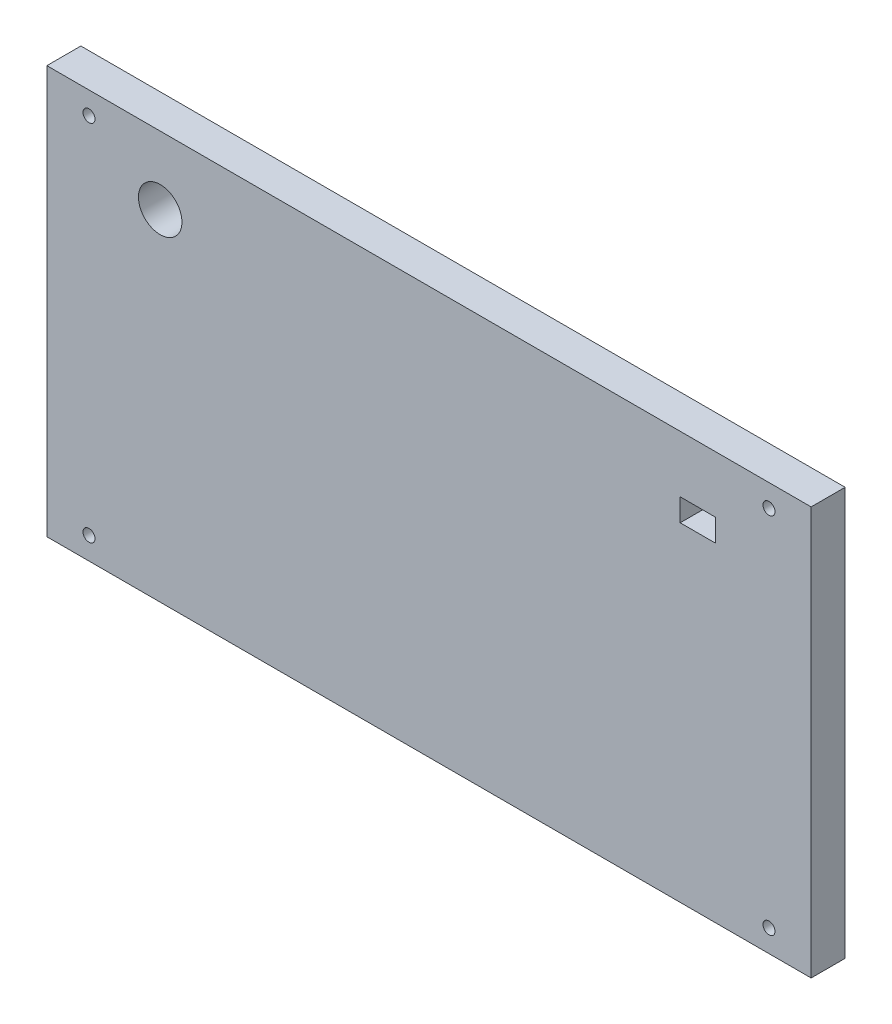
ISO-10303-21;
HEADER;
FILE_DESCRIPTION(('STEP AP214'),'2;1');
FILE_NAME('part.step','',(''),(''),'','','');
FILE_SCHEMA(('AUTOMOTIVE_DESIGN { 1 0 10303 214 1 1 1 1 }'));
ENDSEC;
DATA;
#1=APPLICATION_CONTEXT('core data for automotive mechanical design processes');
#2=APPLICATION_PROTOCOL_DEFINITION('international standard','automotive_design',2000,#1);
#3=PRODUCT_CONTEXT('',#1,'mechanical');
#4=PRODUCT('Part','Part','',(#3));
#5=PRODUCT_RELATED_PRODUCT_CATEGORY('part','',(#4));
#6=PRODUCT_DEFINITION_FORMATION('','',#4);
#7=PRODUCT_DEFINITION_CONTEXT('part definition',#1,'design');
#8=PRODUCT_DEFINITION('design','',#6,#7);
#9=PRODUCT_DEFINITION_SHAPE('','',#8);
#10=(LENGTH_UNIT() NAMED_UNIT(*) SI_UNIT(.MILLI.,.METRE.));
#11=(NAMED_UNIT(*) PLANE_ANGLE_UNIT() SI_UNIT($,.RADIAN.));
#12=(NAMED_UNIT(*) SI_UNIT($,.STERADIAN.) SOLID_ANGLE_UNIT());
#13=UNCERTAINTY_MEASURE_WITH_UNIT(LENGTH_MEASURE(1.E-05),#10,'distance_accuracy_value','');
#14=(GEOMETRIC_REPRESENTATION_CONTEXT(3) GLOBAL_UNCERTAINTY_ASSIGNED_CONTEXT((#13)) GLOBAL_UNIT_ASSIGNED_CONTEXT((#10,
#11,#12)) REPRESENTATION_CONTEXT('',''));
#15=CARTESIAN_POINT('',(0.,0.,0.));
#16=DIRECTION('',(0.,0.,1.));
#17=DIRECTION('',(1.,0.,0.));
#18=AXIS2_PLACEMENT_3D('',#15,#16,#17);
#19=CARTESIAN_POINT('',(0.,0.,19.05));
#20=DIRECTION('',(0.,0.,1.));
#21=DIRECTION('',(1.,0.,0.));
#22=AXIS2_PLACEMENT_3D('',#19,#20,#21);
#23=PLANE('',#22);
#24=DIRECTION('',(0.,1.,0.));
#25=VECTOR('',#24,1.);
#26=CARTESIAN_POINT('',(350.9875,148.0875,19.05));
#27=LINE('',#26,#25);
#28=CARTESIAN_POINT('',(350.9875,148.0875,19.05));
#29=VERTEX_POINT('',#28);
#30=CARTESIAN_POINT('',(350.9875,160.6875,19.05));
#31=VERTEX_POINT('',#30);
#32=EDGE_CURVE('E52',#29,#31,#27,.T.);
#33=ORIENTED_EDGE('',*,*,#32,.F.);
#34=DIRECTION('',(1.,0.,0.));
#35=VECTOR('',#34,1.);
#36=CARTESIAN_POINT('',(331.2375,148.0875,19.05));
#37=LINE('',#36,#35);
#38=CARTESIAN_POINT('',(331.2375,148.0875,19.05));
#39=VERTEX_POINT('',#38);
#40=EDGE_CURVE('E120',#39,#29,#37,.T.);
#41=ORIENTED_EDGE('',*,*,#40,.F.);
#42=DIRECTION('',(0.,-1.,0.));
#43=VECTOR('',#42,1.);
#44=CARTESIAN_POINT('',(331.2375,148.0875,19.05));
#45=LINE('',#44,#43);
#46=CARTESIAN_POINT('',(331.2375,160.6875,19.05));
#47=VERTEX_POINT('',#46);
#48=EDGE_CURVE('E123',#47,#39,#45,.T.);
#49=ORIENTED_EDGE('',*,*,#48,.F.);
#50=DIRECTION('',(-1.,0.,0.));
#51=VECTOR('',#50,1.);
#52=CARTESIAN_POINT('',(331.2375,160.6875,19.05));
#53=LINE('',#52,#51);
#54=EDGE_CURVE('E129',#31,#47,#53,.T.);
#55=ORIENTED_EDGE('',*,*,#54,.F.);
#56=EDGE_LOOP('',(#33,#41,#49,#55));
#57=FACE_BOUND('',#56,.T.);
#58=CARTESIAN_POINT('',(0.,179.9875,19.05));
#59=DIRECTION('',(0.,0.,1.));
#60=DIRECTION('',(-1.,0.,0.));
#61=AXIS2_PLACEMENT_3D('',#58,#59,#60);
#62=CIRCLE('',#61,3.36549999999999);
#63=CARTESIAN_POINT('',(-3.36549999999999,179.9875,19.05));
#64=VERTEX_POINT('',#63);
#65=EDGE_CURVE('E145',#64,#64,#62,.T.);
#66=ORIENTED_EDGE('',*,*,#65,.F.);
#67=EDGE_LOOP('',(#66));
#68=FACE_BOUND('',#67,.T.);
#69=CARTESIAN_POINT('',(381.,-23.6125,19.05));
#70=DIRECTION('',(0.,0.,1.));
#71=DIRECTION('',(-1.,0.,0.));
#72=AXIS2_PLACEMENT_3D('',#69,#70,#71);
#73=CIRCLE('',#72,3.36550000000002);
#74=CARTESIAN_POINT('',(377.6345,-23.6125,19.05));
#75=VERTEX_POINT('',#74);
#76=EDGE_CURVE('E157',#75,#75,#73,.T.);
#77=ORIENTED_EDGE('',*,*,#76,.F.);
#78=EDGE_LOOP('',(#77));
#79=FACE_BOUND('',#78,.T.);
#80=DIRECTION('',(0.,-1.,0.));
#81=VECTOR('',#80,1.);
#82=CARTESIAN_POINT('',(-23.6125000000001,192.4875,19.05));
#83=LINE('',#82,#81);
#84=CARTESIAN_POINT('',(-23.6125000000001,192.4875,19.05));
#85=VERTEX_POINT('',#84);
#86=CARTESIAN_POINT('',(-23.6125000000001,-36.1125,19.05));
#87=VERTEX_POINT('',#86);
#88=EDGE_CURVE('E169',#85,#87,#83,.T.);
#89=ORIENTED_EDGE('',*,*,#88,.T.);
#90=DIRECTION('',(1.,0.,0.));
#91=VECTOR('',#90,1.);
#92=CARTESIAN_POINT('',(-23.6125000000001,-36.1125,19.05));
#93=LINE('',#92,#91);
#94=CARTESIAN_POINT('',(404.6125,-36.1125,19.05));
#95=VERTEX_POINT('',#94);
#96=EDGE_CURVE('E172',#87,#95,#93,.T.);
#97=ORIENTED_EDGE('',*,*,#96,.T.);
#98=DIRECTION('',(0.,1.,0.));
#99=VECTOR('',#98,1.);
#100=CARTESIAN_POINT('',(404.6125,192.4875,19.05));
#101=LINE('',#100,#99);
#102=CARTESIAN_POINT('',(404.6125,192.4875,19.05));
#103=VERTEX_POINT('',#102);
#104=EDGE_CURVE('E175',#95,#103,#101,.T.);
#105=ORIENTED_EDGE('',*,*,#104,.T.);
#106=DIRECTION('',(-1.,0.,0.));
#107=VECTOR('',#106,1.);
#108=CARTESIAN_POINT('',(-23.6125000000001,192.4875,19.05));
#109=LINE('',#108,#107);
#110=EDGE_CURVE('E177',#103,#85,#109,.T.);
#111=ORIENTED_EDGE('',*,*,#110,.T.);
#112=EDGE_LOOP('',(#89,#97,#105,#111));
#113=FACE_BOUND('',#112,.T.);
#114=CARTESIAN_POINT('',(0.,-23.6125,19.05));
#115=DIRECTION('',(0.,0.,1.));
#116=DIRECTION('',(1.,0.,0.));
#117=AXIS2_PLACEMENT_3D('',#114,#115,#116);
#118=CIRCLE('',#117,3.3655);
#119=CARTESIAN_POINT('',(-3.3655,-23.6125,19.05));
#120=VERTEX_POINT('',#119);
#121=EDGE_CURVE('E163',#120,#120,#118,.T.);
#122=ORIENTED_EDGE('',*,*,#121,.F.);
#123=EDGE_LOOP('',(#122));
#124=FACE_BOUND('',#123,.T.);
#125=CARTESIAN_POINT('',(381.,179.9875,19.05));
#126=DIRECTION('',(0.,0.,1.));
#127=DIRECTION('',(1.,0.,0.));
#128=AXIS2_PLACEMENT_3D('',#125,#126,#127);
#129=CIRCLE('',#128,3.36550000000002);
#130=CARTESIAN_POINT('',(377.6345,179.9875,19.05));
#131=VERTEX_POINT('',#130);
#132=EDGE_CURVE('E151',#131,#131,#129,.T.);
#133=ORIENTED_EDGE('',*,*,#132,.F.);
#134=EDGE_LOOP('',(#133));
#135=FACE_BOUND('',#134,.T.);
#136=CARTESIAN_POINT('',(39.8874999999999,154.3875,19.05));
#137=DIRECTION('',(0.,0.,1.));
#138=DIRECTION('',(1.,0.,0.));
#139=AXIS2_PLACEMENT_3D('',#136,#137,#138);
#140=CIRCLE('',#139,12.192);
#141=CARTESIAN_POINT('',(27.6954999999999,154.3875,19.05));
#142=VERTEX_POINT('',#141);
#143=EDGE_CURVE('E139',#142,#142,#140,.T.);
#144=ORIENTED_EDGE('',*,*,#143,.F.);
#145=EDGE_LOOP('',(#144));
#146=FACE_BOUND('',#145,.T.);
#147=ADVANCED_FACE('F37',(#57,#68,#79,#113,#124,#135,#146),#23,.T.);
#148=CARTESIAN_POINT('',(0.,0.,0.));
#149=DIRECTION('',(0.,0.,1.));
#150=DIRECTION('',(1.,0.,0.));
#151=AXIS2_PLACEMENT_3D('',#148,#149,#150);
#152=PLANE('',#151);
#153=DIRECTION('',(1.,0.,0.));
#154=VECTOR('',#153,1.);
#155=CARTESIAN_POINT('',(331.2375,148.0875,0.));
#156=LINE('',#155,#154);
#157=CARTESIAN_POINT('',(331.2375,148.0875,0.));
#158=VERTEX_POINT('',#157);
#159=CARTESIAN_POINT('',(350.9875,148.0875,0.));
#160=VERTEX_POINT('',#159);
#161=EDGE_CURVE('E110',#158,#160,#156,.T.);
#162=ORIENTED_EDGE('',*,*,#161,.T.);
#163=DIRECTION('',(0.,1.,0.));
#164=VECTOR('',#163,1.);
#165=CARTESIAN_POINT('',(350.9875,148.0875,0.));
#166=LINE('',#165,#164);
#167=CARTESIAN_POINT('',(350.9875,160.6875,0.));
#168=VERTEX_POINT('',#167);
#169=EDGE_CURVE('E104',#160,#168,#166,.T.);
#170=ORIENTED_EDGE('',*,*,#169,.T.);
#171=DIRECTION('',(-1.,0.,0.));
#172=VECTOR('',#171,1.);
#173=CARTESIAN_POINT('',(331.2375,160.6875,0.));
#174=LINE('',#173,#172);
#175=CARTESIAN_POINT('',(331.2375,160.6875,0.));
#176=VERTEX_POINT('',#175);
#177=EDGE_CURVE('E113',#168,#176,#174,.T.);
#178=ORIENTED_EDGE('',*,*,#177,.T.);
#179=DIRECTION('',(0.,-1.,0.));
#180=VECTOR('',#179,1.);
#181=CARTESIAN_POINT('',(331.2375,148.0875,0.));
#182=LINE('',#181,#180);
#183=EDGE_CURVE('E60',#176,#158,#182,.T.);
#184=ORIENTED_EDGE('',*,*,#183,.T.);
#185=EDGE_LOOP('',(#162,#170,#178,#184));
#186=FACE_BOUND('',#185,.T.);
#187=DIRECTION('',(0.,-1.,0.));
#188=VECTOR('',#187,1.);
#189=CARTESIAN_POINT('',(-23.6125000000001,192.4875,0.));
#190=LINE('',#189,#188);
#191=CARTESIAN_POINT('',(-23.6125000000001,192.4875,0.));
#192=VERTEX_POINT('',#191);
#193=CARTESIAN_POINT('',(-23.6125000000001,-36.1125,0.));
#194=VERTEX_POINT('',#193);
#195=EDGE_CURVE('E166',#192,#194,#190,.T.);
#196=ORIENTED_EDGE('',*,*,#195,.F.);
#197=DIRECTION('',(-1.,0.,0.));
#198=VECTOR('',#197,1.);
#199=CARTESIAN_POINT('',(-23.6125000000001,192.4875,0.));
#200=LINE('',#199,#198);
#201=CARTESIAN_POINT('',(404.6125,192.4875,0.));
#202=VERTEX_POINT('',#201);
#203=EDGE_CURVE('E173',#202,#192,#200,.T.);
#204=ORIENTED_EDGE('',*,*,#203,.F.);
#205=DIRECTION('',(0.,1.,0.));
#206=VECTOR('',#205,1.);
#207=CARTESIAN_POINT('',(404.6125,192.4875,0.));
#208=LINE('',#207,#206);
#209=CARTESIAN_POINT('',(404.6125,-36.1125,0.));
#210=VERTEX_POINT('',#209);
#211=EDGE_CURVE('E184',#210,#202,#208,.T.);
#212=ORIENTED_EDGE('',*,*,#211,.F.);
#213=DIRECTION('',(1.,0.,0.));
#214=VECTOR('',#213,1.);
#215=CARTESIAN_POINT('',(-23.6125000000001,-36.1125,0.));
#216=LINE('',#215,#214);
#217=EDGE_CURVE('E182',#194,#210,#216,.T.);
#218=ORIENTED_EDGE('',*,*,#217,.F.);
#219=EDGE_LOOP('',(#196,#204,#212,#218));
#220=FACE_BOUND('',#219,.T.);
#221=CARTESIAN_POINT('',(0.,-23.6125,0.));
#222=DIRECTION('',(0.,0.,1.));
#223=DIRECTION('',(1.,0.,0.));
#224=AXIS2_PLACEMENT_3D('',#221,#222,#223);
#225=CIRCLE('',#224,3.3655);
#226=CARTESIAN_POINT('',(-3.3655,-23.6125,0.));
#227=VERTEX_POINT('',#226);
#228=EDGE_CURVE('E160',#227,#227,#225,.T.);
#229=ORIENTED_EDGE('',*,*,#228,.T.);
#230=EDGE_LOOP('',(#229));
#231=FACE_BOUND('',#230,.T.);
#232=CARTESIAN_POINT('',(381.,-23.6125,0.));
#233=DIRECTION('',(0.,0.,1.));
#234=DIRECTION('',(-1.,0.,0.));
#235=AXIS2_PLACEMENT_3D('',#232,#233,#234);
#236=CIRCLE('',#235,3.36550000000002);
#237=CARTESIAN_POINT('',(377.6345,-23.6125,0.));
#238=VERTEX_POINT('',#237);
#239=EDGE_CURVE('E154',#238,#238,#236,.T.);
#240=ORIENTED_EDGE('',*,*,#239,.T.);
#241=EDGE_LOOP('',(#240));
#242=FACE_BOUND('',#241,.T.);
#243=CARTESIAN_POINT('',(381.,179.9875,0.));
#244=DIRECTION('',(0.,0.,1.));
#245=DIRECTION('',(1.,0.,0.));
#246=AXIS2_PLACEMENT_3D('',#243,#244,#245);
#247=CIRCLE('',#246,3.36550000000002);
#248=CARTESIAN_POINT('',(377.6345,179.9875,0.));
#249=VERTEX_POINT('',#248);
#250=EDGE_CURVE('E148',#249,#249,#247,.T.);
#251=ORIENTED_EDGE('',*,*,#250,.T.);
#252=EDGE_LOOP('',(#251));
#253=FACE_BOUND('',#252,.T.);
#254=CARTESIAN_POINT('',(0.,179.9875,0.));
#255=DIRECTION('',(0.,0.,1.));
#256=DIRECTION('',(-1.,0.,0.));
#257=AXIS2_PLACEMENT_3D('',#254,#255,#256);
#258=CIRCLE('',#257,3.36549999999999);
#259=CARTESIAN_POINT('',(-3.36549999999999,179.9875,0.));
#260=VERTEX_POINT('',#259);
#261=EDGE_CURVE('E142',#260,#260,#258,.T.);
#262=ORIENTED_EDGE('',*,*,#261,.T.);
#263=EDGE_LOOP('',(#262));
#264=FACE_BOUND('',#263,.T.);
#265=CARTESIAN_POINT('',(39.8874999999999,154.3875,0.));
#266=DIRECTION('',(0.,0.,1.));
#267=DIRECTION('',(1.,0.,0.));
#268=AXIS2_PLACEMENT_3D('',#265,#266,#267);
#269=CIRCLE('',#268,12.192);
#270=CARTESIAN_POINT('',(27.6954999999999,154.3875,0.));
#271=VERTEX_POINT('',#270);
#272=EDGE_CURVE('E135',#271,#271,#269,.T.);
#273=ORIENTED_EDGE('',*,*,#272,.T.);
#274=EDGE_LOOP('',(#273));
#275=FACE_BOUND('',#274,.T.);
#276=ADVANCED_FACE('F117',(#186,#220,#231,#242,#253,#264,#275),#152,.F.);
#277=CARTESIAN_POINT('',(-23.6125000000001,192.4875,19.05));
#278=DIRECTION('',(1.,0.,0.));
#279=DIRECTION('',(0.,0.,-1.));
#280=AXIS2_PLACEMENT_3D('',#277,#278,#279);
#281=PLANE('',#280);
#282=ORIENTED_EDGE('',*,*,#195,.T.);
#283=DIRECTION('',(0.,0.,-1.));
#284=VECTOR('',#283,1.);
#285=CARTESIAN_POINT('',(-23.6125000000001,-36.1125,19.05));
#286=LINE('',#285,#284);
#287=EDGE_CURVE('E11',#87,#194,#286,.T.);
#288=ORIENTED_EDGE('',*,*,#287,.F.);
#289=ORIENTED_EDGE('',*,*,#88,.F.);
#290=DIRECTION('',(0.,0.,-1.));
#291=VECTOR('',#290,1.);
#292=CARTESIAN_POINT('',(-23.6125000000001,192.4875,19.05));
#293=LINE('',#292,#291);
#294=EDGE_CURVE('E179',#85,#192,#293,.T.);
#295=ORIENTED_EDGE('',*,*,#294,.T.);
#296=EDGE_LOOP('',(#282,#288,#289,#295));
#297=FACE_BOUND('',#296,.T.);
#298=ADVANCED_FACE('F39',(#297),#281,.F.);
#299=CARTESIAN_POINT('',(-23.6125000000001,-36.1125,19.05));
#300=DIRECTION('',(0.,1.,0.));
#301=DIRECTION('',(-1.,0.,0.));
#302=AXIS2_PLACEMENT_3D('',#299,#300,#301);
#303=PLANE('',#302);
#304=ORIENTED_EDGE('',*,*,#217,.T.);
#305=DIRECTION('',(0.,0.,-1.));
#306=VECTOR('',#305,1.);
#307=CARTESIAN_POINT('',(404.6125,-36.1125,19.05));
#308=LINE('',#307,#306);
#309=EDGE_CURVE('E45',#95,#210,#308,.T.);
#310=ORIENTED_EDGE('',*,*,#309,.F.);
#311=ORIENTED_EDGE('',*,*,#96,.F.);
#312=ORIENTED_EDGE('',*,*,#287,.T.);
#313=EDGE_LOOP('',(#304,#310,#311,#312));
#314=FACE_BOUND('',#313,.T.);
#315=ADVANCED_FACE('F211',(#314),#303,.F.);
#316=CARTESIAN_POINT('',(404.6125,192.4875,19.05));
#317=DIRECTION('',(-1.,0.,0.));
#318=DIRECTION('',(0.,0.,1.));
#319=AXIS2_PLACEMENT_3D('',#316,#317,#318);
#320=PLANE('',#319);
#321=ORIENTED_EDGE('',*,*,#211,.T.);
#322=DIRECTION('',(0.,0.,-1.));
#323=VECTOR('',#322,1.);
#324=CARTESIAN_POINT('',(404.6125,192.4875,19.05));
#325=LINE('',#324,#323);
#326=EDGE_CURVE('E189',#103,#202,#325,.T.);
#327=ORIENTED_EDGE('',*,*,#326,.F.);
#328=ORIENTED_EDGE('',*,*,#104,.F.);
#329=ORIENTED_EDGE('',*,*,#309,.T.);
#330=EDGE_LOOP('',(#321,#327,#328,#329));
#331=FACE_BOUND('',#330,.T.);
#332=ADVANCED_FACE('F196',(#331),#320,.F.);
#333=CARTESIAN_POINT('',(-23.6125000000001,192.4875,19.05));
#334=DIRECTION('',(0.,-1.,0.));
#335=DIRECTION('',(0.,0.,-1.));
#336=AXIS2_PLACEMENT_3D('',#333,#334,#335);
#337=PLANE('',#336);
#338=ORIENTED_EDGE('',*,*,#203,.T.);
#339=ORIENTED_EDGE('',*,*,#294,.F.);
#340=ORIENTED_EDGE('',*,*,#110,.F.);
#341=ORIENTED_EDGE('',*,*,#326,.T.);
#342=EDGE_LOOP('',(#338,#339,#340,#341));
#343=FACE_BOUND('',#342,.T.);
#344=ADVANCED_FACE('F204',(#343),#337,.F.);
#345=CARTESIAN_POINT('',(0.,-23.6125,19.05));
#346=DIRECTION('',(0.,0.,-1.));
#347=DIRECTION('',(-1.,0.,0.));
#348=AXIS2_PLACEMENT_3D('',#345,#346,#347);
#349=CYLINDRICAL_SURFACE('',#348,3.3655);
#350=CARTESIAN_POINT('',(-3.3655,-23.6125,19.05));
#351=CARTESIAN_POINT('',(-3.3655,-23.6125,18.8515625));
#352=CARTESIAN_POINT('',(-3.3655,-23.6125,18.653125));
#353=CARTESIAN_POINT('',(-3.3655,-23.6125,18.25625));
#354=CARTESIAN_POINT('',(-3.3655,-23.6125,18.0578125));
#355=CARTESIAN_POINT('',(-3.3655,-23.6125,17.6609375));
#356=CARTESIAN_POINT('',(-3.3655,-23.6125,17.4625));
#357=CARTESIAN_POINT('',(-3.3655,-23.6125,17.065625));
#358=CARTESIAN_POINT('',(-3.3655,-23.6125,16.8671875));
#359=CARTESIAN_POINT('',(-3.3655,-23.6125,16.4703125));
#360=CARTESIAN_POINT('',(-3.3655,-23.6125,16.271875));
#361=CARTESIAN_POINT('',(-3.3655,-23.6125,15.875));
#362=CARTESIAN_POINT('',(-3.3655,-23.6125,15.6765625));
#363=CARTESIAN_POINT('',(-3.3655,-23.6125,15.2796875));
#364=CARTESIAN_POINT('',(-3.3655,-23.6125,15.08125));
#365=CARTESIAN_POINT('',(-3.3655,-23.6125,14.684375));
#366=CARTESIAN_POINT('',(-3.3655,-23.6125,14.4859375));
#367=CARTESIAN_POINT('',(-3.3655,-23.6125,14.0890625));
#368=CARTESIAN_POINT('',(-3.3655,-23.6125,13.890625));
#369=CARTESIAN_POINT('',(-3.3655,-23.6125,13.49375));
#370=CARTESIAN_POINT('',(-3.3655,-23.6125,13.2953125));
#371=CARTESIAN_POINT('',(-3.3655,-23.6125,12.8984375));
#372=CARTESIAN_POINT('',(-3.3655,-23.6125,12.7));
#373=CARTESIAN_POINT('',(-3.3655,-23.6125,12.303125));
#374=CARTESIAN_POINT('',(-3.3655,-23.6125,12.1046875));
#375=CARTESIAN_POINT('',(-3.3655,-23.6125,11.7078125));
#376=CARTESIAN_POINT('',(-3.3655,-23.6125,11.509375));
#377=CARTESIAN_POINT('',(-3.3655,-23.6125,11.1125));
#378=CARTESIAN_POINT('',(-3.3655,-23.6125,10.9140625));
#379=CARTESIAN_POINT('',(-3.3655,-23.6125,10.5171875));
#380=CARTESIAN_POINT('',(-3.3655,-23.6125,10.31875));
#381=CARTESIAN_POINT('',(-3.3655,-23.6125,9.921875));
#382=CARTESIAN_POINT('',(-3.3655,-23.6125,9.7234375));
#383=CARTESIAN_POINT('',(-3.3655,-23.6125,9.3265625));
#384=CARTESIAN_POINT('',(-3.3655,-23.6125,9.128125));
#385=CARTESIAN_POINT('',(-3.3655,-23.6125,8.73125));
#386=CARTESIAN_POINT('',(-3.3655,-23.6125,8.5328125));
#387=CARTESIAN_POINT('',(-3.3655,-23.6125,8.1359375));
#388=CARTESIAN_POINT('',(-3.3655,-23.6125,7.9375));
#389=CARTESIAN_POINT('',(-3.3655,-23.6125,7.540625));
#390=CARTESIAN_POINT('',(-3.3655,-23.6125,7.3421875));
#391=CARTESIAN_POINT('',(-3.3655,-23.6125,6.9453125));
#392=CARTESIAN_POINT('',(-3.3655,-23.6125,6.746875));
#393=CARTESIAN_POINT('',(-3.3655,-23.6125,6.35));
#394=CARTESIAN_POINT('',(-3.3655,-23.6125,6.1515625));
#395=CARTESIAN_POINT('',(-3.3655,-23.6125,5.7546875));
#396=CARTESIAN_POINT('',(-3.3655,-23.6125,5.55625));
#397=CARTESIAN_POINT('',(-3.3655,-23.6125,5.159375));
#398=CARTESIAN_POINT('',(-3.3655,-23.6125,4.9609375));
#399=CARTESIAN_POINT('',(-3.3655,-23.6125,4.5640625));
#400=CARTESIAN_POINT('',(-3.3655,-23.6125,4.365625));
#401=CARTESIAN_POINT('',(-3.3655,-23.6125,3.96875));
#402=CARTESIAN_POINT('',(-3.3655,-23.6125,3.7703125));
#403=CARTESIAN_POINT('',(-3.3655,-23.6125,3.3734375));
#404=CARTESIAN_POINT('',(-3.3655,-23.6125,3.175));
#405=CARTESIAN_POINT('',(-3.3655,-23.6125,2.778125));
#406=CARTESIAN_POINT('',(-3.3655,-23.6125,2.5796875));
#407=CARTESIAN_POINT('',(-3.3655,-23.6125,2.1828125));
#408=CARTESIAN_POINT('',(-3.3655,-23.6125,1.984375));
#409=CARTESIAN_POINT('',(-3.3655,-23.6125,1.5875));
#410=CARTESIAN_POINT('',(-3.3655,-23.6125,1.3890625));
#411=CARTESIAN_POINT('',(-3.3655,-23.6125,0.992187500000001));
#412=CARTESIAN_POINT('',(-3.3655,-23.6125,0.793750000000001));
#413=CARTESIAN_POINT('',(-3.3655,-23.6125,0.396875));
#414=CARTESIAN_POINT('',(-3.3655,-23.6125,0.1984375));
#415=CARTESIAN_POINT('',(-3.3655,-23.6125,0.));
#416=B_SPLINE_CURVE_WITH_KNOTS('',3,(#350,#351,#352,#353,#354,#355,#356,#357,#358,#359,#360,
#361,#362,#363,#364,#365,#366,#367,#368,#369,#370,#371,#372,#373,#374,#375,#376,#377,#378,#379,
#380,#381,#382,#383,#384,#385,#386,#387,#388,#389,#390,#391,#392,#393,#394,#395,#396,#397,#398,
#399,#400,#401,#402,#403,#404,#405,#406,#407,#408,#409,#410,#411,#412,#413,#414,#415),
.UNSPECIFIED.,.F.,.F.,(4,2,2,2,2,2,2,2,2,2,2,2,2,2,2,2,2,2,2,2,2,2,2,2,2,2,2,2,2,2,2,2,4),(0.,
0.595312499999997,1.190625,1.7859375,2.38125,2.9765625,3.571875,4.1671875,4.7625,5.3578125,
5.953125,6.5484375,7.14375,7.7390625,8.334375,8.9296875,9.525,10.1203125,10.715625,11.3109375,
11.90625,12.5015625,13.096875,13.6921875,14.2875,14.8828125,15.478125,16.0734375,16.66875,
17.2640625,17.859375,18.4546875,19.05),.UNSPECIFIED.);
#417=EDGE_CURVE('BSEAM227',#120,#227,#416,.T.);
#418=ORIENTED_EDGE('',*,*,#121,.T.);
#419=ORIENTED_EDGE('',*,*,#228,.F.);
#420=ORIENTED_EDGE('',*,*,#417,.T.);
#421=ORIENTED_EDGE('',*,*,#417,.F.);
#422=EDGE_LOOP('',(#418,#420,#419,#421));
#423=FACE_BOUND('',#422,.T.);
#424=ADVANCED_FACE('F227',(#423),#349,.F.);
#425=CARTESIAN_POINT('',(381.,-23.6125,19.05));
#426=DIRECTION('',(0.,0.,-1.));
#427=DIRECTION('',(-1.,0.,0.));
#428=AXIS2_PLACEMENT_3D('',#425,#426,#427);
#429=CYLINDRICAL_SURFACE('',#428,3.36550000000002);
#430=CARTESIAN_POINT('',(377.6345,-23.6125,19.05));
#431=CARTESIAN_POINT('',(377.6345,-23.6125,18.8515625));
#432=CARTESIAN_POINT('',(377.6345,-23.6125,18.653125));
#433=CARTESIAN_POINT('',(377.6345,-23.6125,18.25625));
#434=CARTESIAN_POINT('',(377.6345,-23.6125,18.0578125));
#435=CARTESIAN_POINT('',(377.6345,-23.6125,17.6609375));
#436=CARTESIAN_POINT('',(377.6345,-23.6125,17.4625));
#437=CARTESIAN_POINT('',(377.6345,-23.6125,17.065625));
#438=CARTESIAN_POINT('',(377.6345,-23.6125,16.8671875));
#439=CARTESIAN_POINT('',(377.6345,-23.6125,16.4703125));
#440=CARTESIAN_POINT('',(377.6345,-23.6125,16.271875));
#441=CARTESIAN_POINT('',(377.6345,-23.6125,15.875));
#442=CARTESIAN_POINT('',(377.6345,-23.6125,15.6765625));
#443=CARTESIAN_POINT('',(377.6345,-23.6125,15.2796875));
#444=CARTESIAN_POINT('',(377.6345,-23.6125,15.08125));
#445=CARTESIAN_POINT('',(377.6345,-23.6125,14.684375));
#446=CARTESIAN_POINT('',(377.6345,-23.6125,14.4859375));
#447=CARTESIAN_POINT('',(377.6345,-23.6125,14.0890625));
#448=CARTESIAN_POINT('',(377.6345,-23.6125,13.890625));
#449=CARTESIAN_POINT('',(377.6345,-23.6125,13.49375));
#450=CARTESIAN_POINT('',(377.6345,-23.6125,13.2953125));
#451=CARTESIAN_POINT('',(377.6345,-23.6125,12.8984375));
#452=CARTESIAN_POINT('',(377.6345,-23.6125,12.7));
#453=CARTESIAN_POINT('',(377.6345,-23.6125,12.303125));
#454=CARTESIAN_POINT('',(377.6345,-23.6125,12.1046875));
#455=CARTESIAN_POINT('',(377.6345,-23.6125,11.7078125));
#456=CARTESIAN_POINT('',(377.6345,-23.6125,11.509375));
#457=CARTESIAN_POINT('',(377.6345,-23.6125,11.1125));
#458=CARTESIAN_POINT('',(377.6345,-23.6125,10.9140625));
#459=CARTESIAN_POINT('',(377.6345,-23.6125,10.5171875));
#460=CARTESIAN_POINT('',(377.6345,-23.6125,10.31875));
#461=CARTESIAN_POINT('',(377.6345,-23.6125,9.921875));
#462=CARTESIAN_POINT('',(377.6345,-23.6125,9.7234375));
#463=CARTESIAN_POINT('',(377.6345,-23.6125,9.3265625));
#464=CARTESIAN_POINT('',(377.6345,-23.6125,9.128125));
#465=CARTESIAN_POINT('',(377.6345,-23.6125,8.73125));
#466=CARTESIAN_POINT('',(377.6345,-23.6125,8.5328125));
#467=CARTESIAN_POINT('',(377.6345,-23.6125,8.1359375));
#468=CARTESIAN_POINT('',(377.6345,-23.6125,7.9375));
#469=CARTESIAN_POINT('',(377.6345,-23.6125,7.540625));
#470=CARTESIAN_POINT('',(377.6345,-23.6125,7.3421875));
#471=CARTESIAN_POINT('',(377.6345,-23.6125,6.9453125));
#472=CARTESIAN_POINT('',(377.6345,-23.6125,6.746875));
#473=CARTESIAN_POINT('',(377.6345,-23.6125,6.35));
#474=CARTESIAN_POINT('',(377.6345,-23.6125,6.1515625));
#475=CARTESIAN_POINT('',(377.6345,-23.6125,5.7546875));
#476=CARTESIAN_POINT('',(377.6345,-23.6125,5.55625));
#477=CARTESIAN_POINT('',(377.6345,-23.6125,5.159375));
#478=CARTESIAN_POINT('',(377.6345,-23.6125,4.9609375));
#479=CARTESIAN_POINT('',(377.6345,-23.6125,4.5640625));
#480=CARTESIAN_POINT('',(377.6345,-23.6125,4.365625));
#481=CARTESIAN_POINT('',(377.6345,-23.6125,3.96875));
#482=CARTESIAN_POINT('',(377.6345,-23.6125,3.7703125));
#483=CARTESIAN_POINT('',(377.6345,-23.6125,3.3734375));
#484=CARTESIAN_POINT('',(377.6345,-23.6125,3.175));
#485=CARTESIAN_POINT('',(377.6345,-23.6125,2.778125));
#486=CARTESIAN_POINT('',(377.6345,-23.6125,2.5796875));
#487=CARTESIAN_POINT('',(377.6345,-23.6125,2.1828125));
#488=CARTESIAN_POINT('',(377.6345,-23.6125,1.984375));
#489=CARTESIAN_POINT('',(377.6345,-23.6125,1.5875));
#490=CARTESIAN_POINT('',(377.6345,-23.6125,1.3890625));
#491=CARTESIAN_POINT('',(377.6345,-23.6125,0.992187500000001));
#492=CARTESIAN_POINT('',(377.6345,-23.6125,0.793750000000001));
#493=CARTESIAN_POINT('',(377.6345,-23.6125,0.396875));
#494=CARTESIAN_POINT('',(377.6345,-23.6125,0.1984375));
#495=CARTESIAN_POINT('',(377.6345,-23.6125,0.));
#496=B_SPLINE_CURVE_WITH_KNOTS('',3,(#430,#431,#432,#433,#434,#435,#436,#437,#438,#439,#440,
#441,#442,#443,#444,#445,#446,#447,#448,#449,#450,#451,#452,#453,#454,#455,#456,#457,#458,#459,
#460,#461,#462,#463,#464,#465,#466,#467,#468,#469,#470,#471,#472,#473,#474,#475,#476,#477,#478,
#479,#480,#481,#482,#483,#484,#485,#486,#487,#488,#489,#490,#491,#492,#493,#494,#495),
.UNSPECIFIED.,.F.,.F.,(4,2,2,2,2,2,2,2,2,2,2,2,2,2,2,2,2,2,2,2,2,2,2,2,2,2,2,2,2,2,2,2,4),(0.,
0.595312499999997,1.190625,1.7859375,2.38125,2.9765625,3.571875,4.1671875,4.7625,5.3578125,
5.953125,6.5484375,7.14375,7.7390625,8.334375,8.9296875,9.525,10.1203125,10.715625,11.3109375,
11.90625,12.5015625,13.096875,13.6921875,14.2875,14.8828125,15.478125,16.0734375,16.66875,
17.2640625,17.859375,18.4546875,19.05),.UNSPECIFIED.);
#497=EDGE_CURVE('BSEAM234',#75,#238,#496,.T.);
#498=ORIENTED_EDGE('',*,*,#76,.T.);
#499=ORIENTED_EDGE('',*,*,#239,.F.);
#500=ORIENTED_EDGE('',*,*,#497,.T.);
#501=ORIENTED_EDGE('',*,*,#497,.F.);
#502=EDGE_LOOP('',(#498,#500,#499,#501));
#503=FACE_BOUND('',#502,.T.);
#504=ADVANCED_FACE('F234',(#503),#429,.F.);
#505=CARTESIAN_POINT('',(381.,179.9875,19.05));
#506=DIRECTION('',(0.,0.,-1.));
#507=DIRECTION('',(-1.,0.,0.));
#508=AXIS2_PLACEMENT_3D('',#505,#506,#507);
#509=CYLINDRICAL_SURFACE('',#508,3.36550000000002);
#510=CARTESIAN_POINT('',(377.6345,179.9875,19.05));
#511=CARTESIAN_POINT('',(377.6345,179.9875,18.8515625));
#512=CARTESIAN_POINT('',(377.6345,179.9875,18.653125));
#513=CARTESIAN_POINT('',(377.6345,179.9875,18.25625));
#514=CARTESIAN_POINT('',(377.6345,179.9875,18.0578125));
#515=CARTESIAN_POINT('',(377.6345,179.9875,17.6609375));
#516=CARTESIAN_POINT('',(377.6345,179.9875,17.4625));
#517=CARTESIAN_POINT('',(377.6345,179.9875,17.065625));
#518=CARTESIAN_POINT('',(377.6345,179.9875,16.8671875));
#519=CARTESIAN_POINT('',(377.6345,179.9875,16.4703125));
#520=CARTESIAN_POINT('',(377.6345,179.9875,16.271875));
#521=CARTESIAN_POINT('',(377.6345,179.9875,15.875));
#522=CARTESIAN_POINT('',(377.6345,179.9875,15.6765625));
#523=CARTESIAN_POINT('',(377.6345,179.9875,15.2796875));
#524=CARTESIAN_POINT('',(377.6345,179.9875,15.08125));
#525=CARTESIAN_POINT('',(377.6345,179.9875,14.684375));
#526=CARTESIAN_POINT('',(377.6345,179.9875,14.4859375));
#527=CARTESIAN_POINT('',(377.6345,179.9875,14.0890625));
#528=CARTESIAN_POINT('',(377.6345,179.9875,13.890625));
#529=CARTESIAN_POINT('',(377.6345,179.9875,13.49375));
#530=CARTESIAN_POINT('',(377.6345,179.9875,13.2953125));
#531=CARTESIAN_POINT('',(377.6345,179.9875,12.8984375));
#532=CARTESIAN_POINT('',(377.6345,179.9875,12.7));
#533=CARTESIAN_POINT('',(377.6345,179.9875,12.303125));
#534=CARTESIAN_POINT('',(377.6345,179.9875,12.1046875));
#535=CARTESIAN_POINT('',(377.6345,179.9875,11.7078125));
#536=CARTESIAN_POINT('',(377.6345,179.9875,11.509375));
#537=CARTESIAN_POINT('',(377.6345,179.9875,11.1125));
#538=CARTESIAN_POINT('',(377.6345,179.9875,10.9140625));
#539=CARTESIAN_POINT('',(377.6345,179.9875,10.5171875));
#540=CARTESIAN_POINT('',(377.6345,179.9875,10.31875));
#541=CARTESIAN_POINT('',(377.6345,179.9875,9.921875));
#542=CARTESIAN_POINT('',(377.6345,179.9875,9.7234375));
#543=CARTESIAN_POINT('',(377.6345,179.9875,9.3265625));
#544=CARTESIAN_POINT('',(377.6345,179.9875,9.128125));
#545=CARTESIAN_POINT('',(377.6345,179.9875,8.73125));
#546=CARTESIAN_POINT('',(377.6345,179.9875,8.5328125));
#547=CARTESIAN_POINT('',(377.6345,179.9875,8.1359375));
#548=CARTESIAN_POINT('',(377.6345,179.9875,7.9375));
#549=CARTESIAN_POINT('',(377.6345,179.9875,7.540625));
#550=CARTESIAN_POINT('',(377.6345,179.9875,7.3421875));
#551=CARTESIAN_POINT('',(377.6345,179.9875,6.9453125));
#552=CARTESIAN_POINT('',(377.6345,179.9875,6.746875));
#553=CARTESIAN_POINT('',(377.6345,179.9875,6.35));
#554=CARTESIAN_POINT('',(377.6345,179.9875,6.1515625));
#555=CARTESIAN_POINT('',(377.6345,179.9875,5.7546875));
#556=CARTESIAN_POINT('',(377.6345,179.9875,5.55625));
#557=CARTESIAN_POINT('',(377.6345,179.9875,5.159375));
#558=CARTESIAN_POINT('',(377.6345,179.9875,4.9609375));
#559=CARTESIAN_POINT('',(377.6345,179.9875,4.5640625));
#560=CARTESIAN_POINT('',(377.6345,179.9875,4.365625));
#561=CARTESIAN_POINT('',(377.6345,179.9875,3.96875));
#562=CARTESIAN_POINT('',(377.6345,179.9875,3.7703125));
#563=CARTESIAN_POINT('',(377.6345,179.9875,3.3734375));
#564=CARTESIAN_POINT('',(377.6345,179.9875,3.175));
#565=CARTESIAN_POINT('',(377.6345,179.9875,2.778125));
#566=CARTESIAN_POINT('',(377.6345,179.9875,2.5796875));
#567=CARTESIAN_POINT('',(377.6345,179.9875,2.1828125));
#568=CARTESIAN_POINT('',(377.6345,179.9875,1.984375));
#569=CARTESIAN_POINT('',(377.6345,179.9875,1.5875));
#570=CARTESIAN_POINT('',(377.6345,179.9875,1.3890625));
#571=CARTESIAN_POINT('',(377.6345,179.9875,0.992187500000001));
#572=CARTESIAN_POINT('',(377.6345,179.9875,0.793750000000001));
#573=CARTESIAN_POINT('',(377.6345,179.9875,0.396875));
#574=CARTESIAN_POINT('',(377.6345,179.9875,0.1984375));
#575=CARTESIAN_POINT('',(377.6345,179.9875,0.));
#576=B_SPLINE_CURVE_WITH_KNOTS('',3,(#510,#511,#512,#513,#514,#515,#516,#517,#518,#519,#520,
#521,#522,#523,#524,#525,#526,#527,#528,#529,#530,#531,#532,#533,#534,#535,#536,#537,#538,#539,
#540,#541,#542,#543,#544,#545,#546,#547,#548,#549,#550,#551,#552,#553,#554,#555,#556,#557,#558,
#559,#560,#561,#562,#563,#564,#565,#566,#567,#568,#569,#570,#571,#572,#573,#574,#575),
.UNSPECIFIED.,.F.,.F.,(4,2,2,2,2,2,2,2,2,2,2,2,2,2,2,2,2,2,2,2,2,2,2,2,2,2,2,2,2,2,2,2,4),(0.,
0.595312499999997,1.190625,1.7859375,2.38125,2.9765625,3.571875,4.1671875,4.7625,5.3578125,
5.953125,6.5484375,7.14375,7.7390625,8.334375,8.9296875,9.525,10.1203125,10.715625,11.3109375,
11.90625,12.5015625,13.096875,13.6921875,14.2875,14.8828125,15.478125,16.0734375,16.66875,
17.2640625,17.859375,18.4546875,19.05),.UNSPECIFIED.);
#577=EDGE_CURVE('BSEAM239',#131,#249,#576,.T.);
#578=ORIENTED_EDGE('',*,*,#132,.T.);
#579=ORIENTED_EDGE('',*,*,#250,.F.);
#580=ORIENTED_EDGE('',*,*,#577,.T.);
#581=ORIENTED_EDGE('',*,*,#577,.F.);
#582=EDGE_LOOP('',(#578,#580,#579,#581));
#583=FACE_BOUND('',#582,.T.);
#584=ADVANCED_FACE('F239',(#583),#509,.F.);
#585=CARTESIAN_POINT('',(0.,179.9875,19.05));
#586=DIRECTION('',(0.,0.,-1.));
#587=DIRECTION('',(-1.,0.,0.));
#588=AXIS2_PLACEMENT_3D('',#585,#586,#587);
#589=CYLINDRICAL_SURFACE('',#588,3.36549999999999);
#590=CARTESIAN_POINT('',(-3.36549999999999,179.9875,19.05));
#591=CARTESIAN_POINT('',(-3.36549999999999,179.9875,18.8515625));
#592=CARTESIAN_POINT('',(-3.36549999999999,179.9875,18.653125));
#593=CARTESIAN_POINT('',(-3.36549999999999,179.9875,18.25625));
#594=CARTESIAN_POINT('',(-3.36549999999999,179.9875,18.0578125));
#595=CARTESIAN_POINT('',(-3.36549999999999,179.9875,17.6609375));
#596=CARTESIAN_POINT('',(-3.36549999999999,179.9875,17.4625));
#597=CARTESIAN_POINT('',(-3.36549999999999,179.9875,17.065625));
#598=CARTESIAN_POINT('',(-3.36549999999999,179.9875,16.8671875));
#599=CARTESIAN_POINT('',(-3.36549999999999,179.9875,16.4703125));
#600=CARTESIAN_POINT('',(-3.36549999999999,179.9875,16.271875));
#601=CARTESIAN_POINT('',(-3.36549999999999,179.9875,15.875));
#602=CARTESIAN_POINT('',(-3.36549999999999,179.9875,15.6765625));
#603=CARTESIAN_POINT('',(-3.36549999999999,179.9875,15.2796875));
#604=CARTESIAN_POINT('',(-3.36549999999999,179.9875,15.08125));
#605=CARTESIAN_POINT('',(-3.36549999999999,179.9875,14.684375));
#606=CARTESIAN_POINT('',(-3.36549999999999,179.9875,14.4859375));
#607=CARTESIAN_POINT('',(-3.36549999999999,179.9875,14.0890625));
#608=CARTESIAN_POINT('',(-3.36549999999999,179.9875,13.890625));
#609=CARTESIAN_POINT('',(-3.36549999999999,179.9875,13.49375));
#610=CARTESIAN_POINT('',(-3.36549999999999,179.9875,13.2953125));
#611=CARTESIAN_POINT('',(-3.36549999999999,179.9875,12.8984375));
#612=CARTESIAN_POINT('',(-3.36549999999999,179.9875,12.7));
#613=CARTESIAN_POINT('',(-3.36549999999999,179.9875,12.303125));
#614=CARTESIAN_POINT('',(-3.36549999999999,179.9875,12.1046875));
#615=CARTESIAN_POINT('',(-3.36549999999999,179.9875,11.7078125));
#616=CARTESIAN_POINT('',(-3.36549999999999,179.9875,11.509375));
#617=CARTESIAN_POINT('',(-3.36549999999999,179.9875,11.1125));
#618=CARTESIAN_POINT('',(-3.36549999999999,179.9875,10.9140625));
#619=CARTESIAN_POINT('',(-3.36549999999999,179.9875,10.5171875));
#620=CARTESIAN_POINT('',(-3.36549999999999,179.9875,10.31875));
#621=CARTESIAN_POINT('',(-3.36549999999999,179.9875,9.921875));
#622=CARTESIAN_POINT('',(-3.36549999999999,179.9875,9.7234375));
#623=CARTESIAN_POINT('',(-3.36549999999999,179.9875,9.3265625));
#624=CARTESIAN_POINT('',(-3.36549999999999,179.9875,9.128125));
#625=CARTESIAN_POINT('',(-3.36549999999999,179.9875,8.73125));
#626=CARTESIAN_POINT('',(-3.36549999999999,179.9875,8.5328125));
#627=CARTESIAN_POINT('',(-3.36549999999999,179.9875,8.1359375));
#628=CARTESIAN_POINT('',(-3.36549999999999,179.9875,7.9375));
#629=CARTESIAN_POINT('',(-3.36549999999999,179.9875,7.540625));
#630=CARTESIAN_POINT('',(-3.36549999999999,179.9875,7.3421875));
#631=CARTESIAN_POINT('',(-3.36549999999999,179.9875,6.9453125));
#632=CARTESIAN_POINT('',(-3.36549999999999,179.9875,6.746875));
#633=CARTESIAN_POINT('',(-3.36549999999999,179.9875,6.35));
#634=CARTESIAN_POINT('',(-3.36549999999999,179.9875,6.1515625));
#635=CARTESIAN_POINT('',(-3.36549999999999,179.9875,5.7546875));
#636=CARTESIAN_POINT('',(-3.36549999999999,179.9875,5.55625));
#637=CARTESIAN_POINT('',(-3.36549999999999,179.9875,5.159375));
#638=CARTESIAN_POINT('',(-3.36549999999999,179.9875,4.9609375));
#639=CARTESIAN_POINT('',(-3.36549999999999,179.9875,4.5640625));
#640=CARTESIAN_POINT('',(-3.36549999999999,179.9875,4.365625));
#641=CARTESIAN_POINT('',(-3.36549999999999,179.9875,3.96875));
#642=CARTESIAN_POINT('',(-3.36549999999999,179.9875,3.7703125));
#643=CARTESIAN_POINT('',(-3.36549999999999,179.9875,3.3734375));
#644=CARTESIAN_POINT('',(-3.36549999999999,179.9875,3.175));
#645=CARTESIAN_POINT('',(-3.36549999999999,179.9875,2.778125));
#646=CARTESIAN_POINT('',(-3.36549999999999,179.9875,2.5796875));
#647=CARTESIAN_POINT('',(-3.36549999999999,179.9875,2.1828125));
#648=CARTESIAN_POINT('',(-3.36549999999999,179.9875,1.984375));
#649=CARTESIAN_POINT('',(-3.36549999999999,179.9875,1.5875));
#650=CARTESIAN_POINT('',(-3.36549999999999,179.9875,1.3890625));
#651=CARTESIAN_POINT('',(-3.36549999999999,179.9875,0.992187500000001));
#652=CARTESIAN_POINT('',(-3.36549999999999,179.9875,0.793750000000001));
#653=CARTESIAN_POINT('',(-3.36549999999999,179.9875,0.396875));
#654=CARTESIAN_POINT('',(-3.36549999999999,179.9875,0.1984375));
#655=CARTESIAN_POINT('',(-3.36549999999999,179.9875,0.));
#656=B_SPLINE_CURVE_WITH_KNOTS('',3,(#590,#591,#592,#593,#594,#595,#596,#597,#598,#599,#600,
#601,#602,#603,#604,#605,#606,#607,#608,#609,#610,#611,#612,#613,#614,#615,#616,#617,#618,#619,
#620,#621,#622,#623,#624,#625,#626,#627,#628,#629,#630,#631,#632,#633,#634,#635,#636,#637,#638,
#639,#640,#641,#642,#643,#644,#645,#646,#647,#648,#649,#650,#651,#652,#653,#654,#655),
.UNSPECIFIED.,.F.,.F.,(4,2,2,2,2,2,2,2,2,2,2,2,2,2,2,2,2,2,2,2,2,2,2,2,2,2,2,2,2,2,2,2,4),(0.,
0.595312499999997,1.190625,1.7859375,2.38125,2.9765625,3.571875,4.1671875,4.7625,5.3578125,
5.953125,6.5484375,7.14375,7.7390625,8.334375,8.9296875,9.525,10.1203125,10.715625,11.3109375,
11.90625,12.5015625,13.096875,13.6921875,14.2875,14.8828125,15.478125,16.0734375,16.66875,
17.2640625,17.859375,18.4546875,19.05),.UNSPECIFIED.);
#657=EDGE_CURVE('BSEAM255',#64,#260,#656,.T.);
#658=ORIENTED_EDGE('',*,*,#65,.T.);
#659=ORIENTED_EDGE('',*,*,#261,.F.);
#660=ORIENTED_EDGE('',*,*,#657,.T.);
#661=ORIENTED_EDGE('',*,*,#657,.F.);
#662=EDGE_LOOP('',(#658,#660,#659,#661));
#663=FACE_BOUND('',#662,.T.);
#664=ADVANCED_FACE('F255',(#663),#589,.F.);
#665=CARTESIAN_POINT('',(39.8874999999999,154.3875,19.05));
#666=DIRECTION('',(0.,0.,-1.));
#667=DIRECTION('',(-1.,0.,0.));
#668=AXIS2_PLACEMENT_3D('',#665,#666,#667);
#669=CYLINDRICAL_SURFACE('',#668,12.192);
#670=CARTESIAN_POINT('',(27.6954999999999,154.3875,19.05));
#671=CARTESIAN_POINT('',(27.6954999999999,154.3875,18.8515625));
#672=CARTESIAN_POINT('',(27.6954999999999,154.3875,18.653125));
#673=CARTESIAN_POINT('',(27.6954999999999,154.3875,18.25625));
#674=CARTESIAN_POINT('',(27.6954999999999,154.3875,18.0578125));
#675=CARTESIAN_POINT('',(27.6954999999999,154.3875,17.6609375));
#676=CARTESIAN_POINT('',(27.6954999999999,154.3875,17.4625));
#677=CARTESIAN_POINT('',(27.6954999999999,154.3875,17.065625));
#678=CARTESIAN_POINT('',(27.6954999999999,154.3875,16.8671875));
#679=CARTESIAN_POINT('',(27.6954999999999,154.3875,16.4703125));
#680=CARTESIAN_POINT('',(27.6954999999999,154.3875,16.271875));
#681=CARTESIAN_POINT('',(27.6954999999999,154.3875,15.875));
#682=CARTESIAN_POINT('',(27.6954999999999,154.3875,15.6765625));
#683=CARTESIAN_POINT('',(27.6954999999999,154.3875,15.2796875));
#684=CARTESIAN_POINT('',(27.6954999999999,154.3875,15.08125));
#685=CARTESIAN_POINT('',(27.6954999999999,154.3875,14.684375));
#686=CARTESIAN_POINT('',(27.6954999999999,154.3875,14.4859375));
#687=CARTESIAN_POINT('',(27.6954999999999,154.3875,14.0890625));
#688=CARTESIAN_POINT('',(27.6954999999999,154.3875,13.890625));
#689=CARTESIAN_POINT('',(27.6954999999999,154.3875,13.49375));
#690=CARTESIAN_POINT('',(27.6954999999999,154.3875,13.2953125));
#691=CARTESIAN_POINT('',(27.6954999999999,154.3875,12.8984375));
#692=CARTESIAN_POINT('',(27.6954999999999,154.3875,12.7));
#693=CARTESIAN_POINT('',(27.6954999999999,154.3875,12.303125));
#694=CARTESIAN_POINT('',(27.6954999999999,154.3875,12.1046875));
#695=CARTESIAN_POINT('',(27.6954999999999,154.3875,11.7078125));
#696=CARTESIAN_POINT('',(27.6954999999999,154.3875,11.509375));
#697=CARTESIAN_POINT('',(27.6954999999999,154.3875,11.1125));
#698=CARTESIAN_POINT('',(27.6954999999999,154.3875,10.9140625));
#699=CARTESIAN_POINT('',(27.6954999999999,154.3875,10.5171875));
#700=CARTESIAN_POINT('',(27.6954999999999,154.3875,10.31875));
#701=CARTESIAN_POINT('',(27.6954999999999,154.3875,9.921875));
#702=CARTESIAN_POINT('',(27.6954999999999,154.3875,9.7234375));
#703=CARTESIAN_POINT('',(27.6954999999999,154.3875,9.3265625));
#704=CARTESIAN_POINT('',(27.6954999999999,154.3875,9.128125));
#705=CARTESIAN_POINT('',(27.6954999999999,154.3875,8.73125));
#706=CARTESIAN_POINT('',(27.6954999999999,154.3875,8.5328125));
#707=CARTESIAN_POINT('',(27.6954999999999,154.3875,8.1359375));
#708=CARTESIAN_POINT('',(27.6954999999999,154.3875,7.9375));
#709=CARTESIAN_POINT('',(27.6954999999999,154.3875,7.540625));
#710=CARTESIAN_POINT('',(27.6954999999999,154.3875,7.3421875));
#711=CARTESIAN_POINT('',(27.6954999999999,154.3875,6.9453125));
#712=CARTESIAN_POINT('',(27.6954999999999,154.3875,6.746875));
#713=CARTESIAN_POINT('',(27.6954999999999,154.3875,6.35));
#714=CARTESIAN_POINT('',(27.6954999999999,154.3875,6.1515625));
#715=CARTESIAN_POINT('',(27.6954999999999,154.3875,5.7546875));
#716=CARTESIAN_POINT('',(27.6954999999999,154.3875,5.55625));
#717=CARTESIAN_POINT('',(27.6954999999999,154.3875,5.159375));
#718=CARTESIAN_POINT('',(27.6954999999999,154.3875,4.9609375));
#719=CARTESIAN_POINT('',(27.6954999999999,154.3875,4.5640625));
#720=CARTESIAN_POINT('',(27.6954999999999,154.3875,4.365625));
#721=CARTESIAN_POINT('',(27.6954999999999,154.3875,3.96875));
#722=CARTESIAN_POINT('',(27.6954999999999,154.3875,3.7703125));
#723=CARTESIAN_POINT('',(27.6954999999999,154.3875,3.3734375));
#724=CARTESIAN_POINT('',(27.6954999999999,154.3875,3.175));
#725=CARTESIAN_POINT('',(27.6954999999999,154.3875,2.778125));
#726=CARTESIAN_POINT('',(27.6954999999999,154.3875,2.5796875));
#727=CARTESIAN_POINT('',(27.6954999999999,154.3875,2.1828125));
#728=CARTESIAN_POINT('',(27.6954999999999,154.3875,1.984375));
#729=CARTESIAN_POINT('',(27.6954999999999,154.3875,1.5875));
#730=CARTESIAN_POINT('',(27.6954999999999,154.3875,1.3890625));
#731=CARTESIAN_POINT('',(27.6954999999999,154.3875,0.992187500000001));
#732=CARTESIAN_POINT('',(27.6954999999999,154.3875,0.793750000000001));
#733=CARTESIAN_POINT('',(27.6954999999999,154.3875,0.396875));
#734=CARTESIAN_POINT('',(27.6954999999999,154.3875,0.1984375));
#735=CARTESIAN_POINT('',(27.6954999999999,154.3875,0.));
#736=B_SPLINE_CURVE_WITH_KNOTS('',3,(#670,#671,#672,#673,#674,#675,#676,#677,#678,#679,#680,
#681,#682,#683,#684,#685,#686,#687,#688,#689,#690,#691,#692,#693,#694,#695,#696,#697,#698,#699,
#700,#701,#702,#703,#704,#705,#706,#707,#708,#709,#710,#711,#712,#713,#714,#715,#716,#717,#718,
#719,#720,#721,#722,#723,#724,#725,#726,#727,#728,#729,#730,#731,#732,#733,#734,#735),
.UNSPECIFIED.,.F.,.F.,(4,2,2,2,2,2,2,2,2,2,2,2,2,2,2,2,2,2,2,2,2,2,2,2,2,2,2,2,2,2,2,2,4),(0.,
0.595312499999997,1.190625,1.7859375,2.38125,2.9765625,3.571875,4.1671875,4.7625,5.3578125,
5.953125,6.5484375,7.14375,7.7390625,8.334375,8.9296875,9.525,10.1203125,10.715625,11.3109375,
11.90625,12.5015625,13.096875,13.6921875,14.2875,14.8828125,15.478125,16.0734375,16.66875,
17.2640625,17.859375,18.4546875,19.05),.UNSPECIFIED.);
#737=EDGE_CURVE('BSEAM253',#142,#271,#736,.T.);
#738=ORIENTED_EDGE('',*,*,#143,.T.);
#739=ORIENTED_EDGE('',*,*,#272,.F.);
#740=ORIENTED_EDGE('',*,*,#737,.T.);
#741=ORIENTED_EDGE('',*,*,#737,.F.);
#742=EDGE_LOOP('',(#738,#740,#739,#741));
#743=FACE_BOUND('',#742,.T.);
#744=ADVANCED_FACE('F253',(#743),#669,.F.);
#745=CARTESIAN_POINT('',(350.9875,148.0875,0.));
#746=DIRECTION('',(1.,0.,0.));
#747=DIRECTION('',(0.,0.,-1.));
#748=AXIS2_PLACEMENT_3D('',#745,#746,#747);
#749=PLANE('',#748);
#750=ORIENTED_EDGE('',*,*,#32,.T.);
#751=DIRECTION('',(0.,0.,1.));
#752=VECTOR('',#751,1.);
#753=CARTESIAN_POINT('',(350.9875,160.6875,0.));
#754=LINE('',#753,#752);
#755=EDGE_CURVE('E100',#168,#31,#754,.T.);
#756=ORIENTED_EDGE('',*,*,#755,.F.);
#757=ORIENTED_EDGE('',*,*,#169,.F.);
#758=DIRECTION('',(0.,0.,1.));
#759=VECTOR('',#758,1.);
#760=CARTESIAN_POINT('',(350.9875,148.0875,0.));
#761=LINE('',#760,#759);
#762=EDGE_CURVE('E133',#160,#29,#761,.T.);
#763=ORIENTED_EDGE('',*,*,#762,.T.);
#764=EDGE_LOOP('',(#750,#756,#757,#763));
#765=FACE_BOUND('',#764,.T.);
#766=ADVANCED_FACE('F102',(#765),#749,.F.);
#767=CARTESIAN_POINT('',(331.2375,148.0875,0.));
#768=DIRECTION('',(0.,-1.,0.));
#769=DIRECTION('',(0.,0.,-1.));
#770=AXIS2_PLACEMENT_3D('',#767,#768,#769);
#771=PLANE('',#770);
#772=ORIENTED_EDGE('',*,*,#40,.T.);
#773=ORIENTED_EDGE('',*,*,#762,.F.);
#774=ORIENTED_EDGE('',*,*,#161,.F.);
#775=DIRECTION('',(0.,0.,1.));
#776=VECTOR('',#775,1.);
#777=CARTESIAN_POINT('',(331.2375,148.0875,0.));
#778=LINE('',#777,#776);
#779=EDGE_CURVE('E136',#158,#39,#778,.T.);
#780=ORIENTED_EDGE('',*,*,#779,.T.);
#781=EDGE_LOOP('',(#772,#773,#774,#780));
#782=FACE_BOUND('',#781,.T.);
#783=ADVANCED_FACE('F262',(#782),#771,.F.);
#784=CARTESIAN_POINT('',(331.2375,148.0875,0.));
#785=DIRECTION('',(-1.,0.,0.));
#786=DIRECTION('',(0.,0.,1.));
#787=AXIS2_PLACEMENT_3D('',#784,#785,#786);
#788=PLANE('',#787);
#789=ORIENTED_EDGE('',*,*,#48,.T.);
#790=ORIENTED_EDGE('',*,*,#779,.F.);
#791=ORIENTED_EDGE('',*,*,#183,.F.);
#792=DIRECTION('',(0.,0.,1.));
#793=VECTOR('',#792,1.);
#794=CARTESIAN_POINT('',(331.2375,160.6875,0.));
#795=LINE('',#794,#793);
#796=EDGE_CURVE('E109',#176,#47,#795,.T.);
#797=ORIENTED_EDGE('',*,*,#796,.T.);
#798=EDGE_LOOP('',(#789,#790,#791,#797));
#799=FACE_BOUND('',#798,.T.);
#800=ADVANCED_FACE('F318',(#799),#788,.F.);
#801=CARTESIAN_POINT('',(331.2375,160.6875,0.));
#802=DIRECTION('',(0.,1.,0.));
#803=DIRECTION('',(0.,0.,1.));
#804=AXIS2_PLACEMENT_3D('',#801,#802,#803);
#805=PLANE('',#804);
#806=ORIENTED_EDGE('',*,*,#54,.T.);
#807=ORIENTED_EDGE('',*,*,#796,.F.);
#808=ORIENTED_EDGE('',*,*,#177,.F.);
#809=ORIENTED_EDGE('',*,*,#755,.T.);
#810=EDGE_LOOP('',(#806,#807,#808,#809));
#811=FACE_BOUND('',#810,.T.);
#812=ADVANCED_FACE('F114',(#811),#805,.F.);
#813=CLOSED_SHELL('',(#147,#276,#298,#315,#332,#344,#424,#504,#584,#664,#744,#766,#783,#800,#812));
#814=MANIFOLD_SOLID_BREP('B2',#813);
#815=ADVANCED_BREP_SHAPE_REPRESENTATION('',(#18,#814),#14);
#816=SHAPE_DEFINITION_REPRESENTATION(#9,#815);
ENDSEC;
END-ISO-10303-21;
